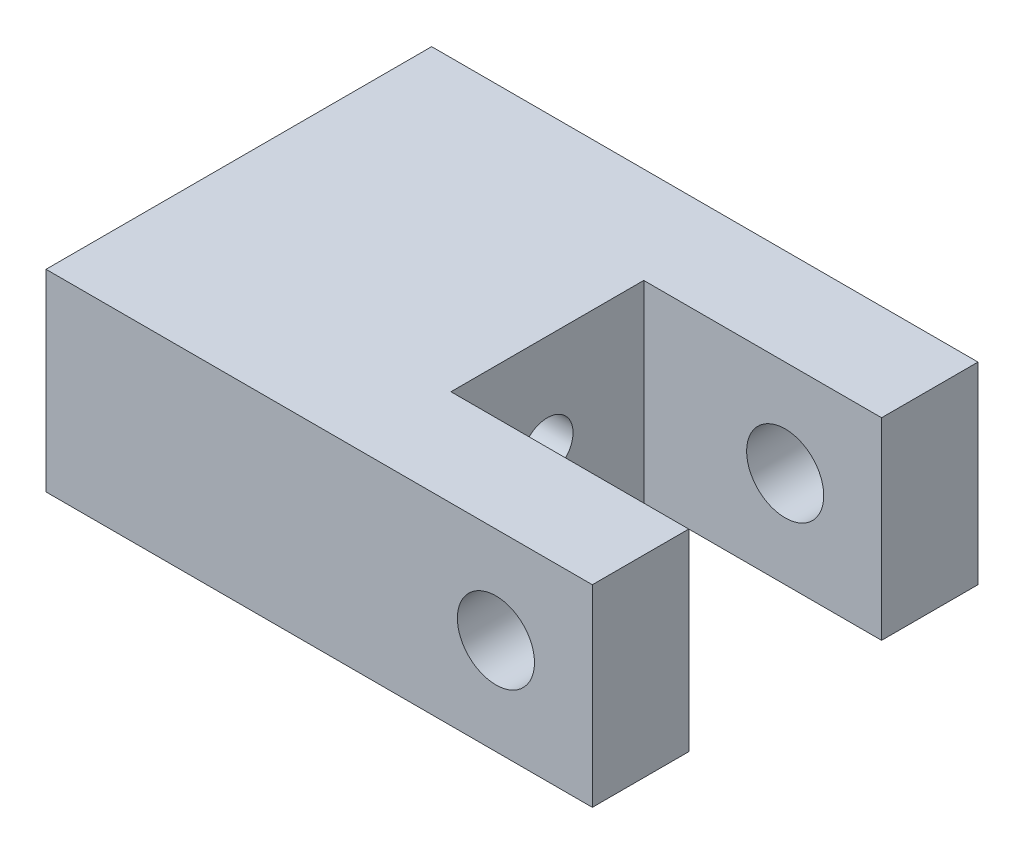
ISO-10303-21;
HEADER;
FILE_DESCRIPTION(('STEP AP214'),'2;1');
FILE_NAME('part.step','',(''),(''),'','','');
FILE_SCHEMA(('AUTOMOTIVE_DESIGN { 1 0 10303 214 1 1 1 1 }'));
ENDSEC;
DATA;
#1=APPLICATION_CONTEXT('core data for automotive mechanical design processes');
#2=APPLICATION_PROTOCOL_DEFINITION('international standard','automotive_design',2000,#1);
#3=PRODUCT_CONTEXT('',#1,'mechanical');
#4=PRODUCT('Part','Part','',(#3));
#5=PRODUCT_RELATED_PRODUCT_CATEGORY('part','',(#4));
#6=PRODUCT_DEFINITION_FORMATION('','',#4);
#7=PRODUCT_DEFINITION_CONTEXT('part definition',#1,'design');
#8=PRODUCT_DEFINITION('design','',#6,#7);
#9=PRODUCT_DEFINITION_SHAPE('','',#8);
#10=(LENGTH_UNIT() NAMED_UNIT(*) SI_UNIT(.MILLI.,.METRE.));
#11=(NAMED_UNIT(*) PLANE_ANGLE_UNIT() SI_UNIT($,.RADIAN.));
#12=(NAMED_UNIT(*) SI_UNIT($,.STERADIAN.) SOLID_ANGLE_UNIT());
#13=UNCERTAINTY_MEASURE_WITH_UNIT(LENGTH_MEASURE(1.E-05),#10,'distance_accuracy_value','');
#14=(GEOMETRIC_REPRESENTATION_CONTEXT(3) GLOBAL_UNCERTAINTY_ASSIGNED_CONTEXT((#13)) GLOBAL_UNIT_ASSIGNED_CONTEXT((#10,
#11,#12)) REPRESENTATION_CONTEXT('',''));
#15=CARTESIAN_POINT('',(0.,0.,0.));
#16=DIRECTION('',(0.,0.,1.));
#17=DIRECTION('',(1.,0.,0.));
#18=AXIS2_PLACEMENT_3D('',#15,#16,#17);
#19=CARTESIAN_POINT('',(15.,15.,30.));
#20=DIRECTION('',(-1.,0.,0.));
#21=DIRECTION('',(0.,0.,1.));
#22=AXIS2_PLACEMENT_3D('',#19,#20,#21);
#23=PLANE('',#22);
#24=DIRECTION('',(0.,0.,-1.));
#25=VECTOR('',#24,1.);
#26=CARTESIAN_POINT('',(15.,15.,30.));
#27=LINE('',#26,#25);
#28=CARTESIAN_POINT('',(15.,15.,-15.));
#29=VERTEX_POINT('',#28);
#30=CARTESIAN_POINT('',(15.,15.,-30.));
#31=VERTEX_POINT('',#30);
#32=EDGE_CURVE('E216',#29,#31,#27,.T.);
#33=ORIENTED_EDGE('',*,*,#32,.F.);
#34=DIRECTION('',(0.,1.,0.));
#35=VECTOR('',#34,1.);
#36=CARTESIAN_POINT('',(15.,-15.,-15.));
#37=LINE('',#36,#35);
#38=CARTESIAN_POINT('',(15.,-15.,-15.));
#39=VERTEX_POINT('',#38);
#40=EDGE_CURVE('E195',#39,#29,#37,.T.);
#41=ORIENTED_EDGE('',*,*,#40,.F.);
#42=DIRECTION('',(0.,0.,-1.));
#43=VECTOR('',#42,1.);
#44=CARTESIAN_POINT('',(15.,-15.,30.));
#45=LINE('',#44,#43);
#46=CARTESIAN_POINT('',(15.,-15.,-30.));
#47=VERTEX_POINT('',#46);
#48=EDGE_CURVE('E230',#39,#47,#45,.T.);
#49=ORIENTED_EDGE('',*,*,#48,.T.);
#50=DIRECTION('',(0.,-1.,0.));
#51=VECTOR('',#50,1.);
#52=CARTESIAN_POINT('',(15.,15.,-30.));
#53=LINE('',#52,#51);
#54=EDGE_CURVE('E239',#31,#47,#53,.T.);
#55=ORIENTED_EDGE('',*,*,#54,.F.);
#56=EDGE_LOOP('',(#33,#41,#49,#55));
#57=FACE_BOUND('',#56,.T.);
#58=ADVANCED_FACE('F52',(#57),#23,.F.);
#59=CARTESIAN_POINT('',(0.,0.,30.));
#60=DIRECTION('',(0.,0.,1.));
#61=DIRECTION('',(1.,0.,0.));
#62=AXIS2_PLACEMENT_3D('',#59,#60,#61);
#63=CYLINDRICAL_SURFACE('',#62,5.99999999999999);
#64=CARTESIAN_POINT('',(0.,0.,-15.));
#65=DIRECTION('',(0.,0.,-1.));
#66=DIRECTION('',(-1.,0.,0.));
#67=AXIS2_PLACEMENT_3D('',#64,#65,#66);
#68=CIRCLE('',#67,5.99999999999999);
#69=CARTESIAN_POINT('',(-5.99999999999999,0.,-15.));
#70=VERTEX_POINT('',#69);
#71=EDGE_CURVE('E56',#70,#70,#68,.F.);
#72=ORIENTED_EDGE('',*,*,#71,.T.);
#73=EDGE_LOOP('',(#72));
#74=FACE_BOUND('',#73,.T.);
#75=CARTESIAN_POINT('',(0.,0.,-30.));
#76=DIRECTION('',(0.,0.,1.));
#77=DIRECTION('',(1.,0.,0.));
#78=AXIS2_PLACEMENT_3D('',#75,#76,#77);
#79=CIRCLE('',#78,5.99999999999999);
#80=CARTESIAN_POINT('',(5.99999999999999,0.,-30.));
#81=VERTEX_POINT('',#80);
#82=EDGE_CURVE('E202',#81,#81,#79,.T.);
#83=ORIENTED_EDGE('',*,*,#82,.F.);
#84=EDGE_LOOP('',(#83));
#85=FACE_BOUND('',#84,.T.);
#86=ADVANCED_FACE('F254',(#74,#85),#63,.F.);
#87=CARTESIAN_POINT('',(-70.,15.,30.));
#88=DIRECTION('',(1.,0.,0.));
#89=DIRECTION('',(0.,0.,-1.));
#90=AXIS2_PLACEMENT_3D('',#87,#88,#89);
#91=PLANE('',#90);
#92=CARTESIAN_POINT('',(-70.,0.,20.));
#93=DIRECTION('',(-1.,0.,0.));
#94=DIRECTION('',(0.,0.,1.));
#95=AXIS2_PLACEMENT_3D('',#92,#93,#94);
#96=CIRCLE('',#95,5.1);
#97=CARTESIAN_POINT('',(-70.,0.,25.1));
#98=VERTEX_POINT('',#97);
#99=EDGE_CURVE('E146',#98,#98,#96,.T.);
#100=ORIENTED_EDGE('',*,*,#99,.F.);
#101=EDGE_LOOP('',(#100));
#102=FACE_BOUND('',#101,.T.);
#103=CARTESIAN_POINT('',(-70.,0.,-20.));
#104=DIRECTION('',(-1.,0.,0.));
#105=DIRECTION('',(0.,0.,1.));
#106=AXIS2_PLACEMENT_3D('',#103,#104,#105);
#107=CIRCLE('',#106,5.1);
#108=CARTESIAN_POINT('',(-70.,0.,-14.9));
#109=VERTEX_POINT('',#108);
#110=EDGE_CURVE('E145',#109,#109,#107,.T.);
#111=ORIENTED_EDGE('',*,*,#110,.F.);
#112=EDGE_LOOP('',(#111));
#113=FACE_BOUND('',#112,.T.);
#114=CARTESIAN_POINT('',(-70.,0.,0.));
#115=DIRECTION('',(-1.,0.,0.));
#116=DIRECTION('',(0.,0.,1.));
#117=AXIS2_PLACEMENT_3D('',#114,#115,#116);
#118=CIRCLE('',#117,3.99999999999999);
#119=CARTESIAN_POINT('',(-70.,0.,4.));
#120=VERTEX_POINT('',#119);
#121=EDGE_CURVE('E160',#120,#120,#118,.T.);
#122=ORIENTED_EDGE('',*,*,#121,.F.);
#123=EDGE_LOOP('',(#122));
#124=FACE_BOUND('',#123,.T.);
#125=DIRECTION('',(0.,0.,1.));
#126=VECTOR('',#125,1.);
#127=CARTESIAN_POINT('',(-70.,-15.,30.));
#128=LINE('',#127,#126);
#129=CARTESIAN_POINT('',(-70.,-15.,-30.));
#130=VERTEX_POINT('',#129);
#131=CARTESIAN_POINT('',(-70.,-15.,30.));
#132=VERTEX_POINT('',#131);
#133=EDGE_CURVE('E210',#130,#132,#128,.T.);
#134=ORIENTED_EDGE('',*,*,#133,.T.);
#135=DIRECTION('',(0.,-1.,0.));
#136=VECTOR('',#135,1.);
#137=CARTESIAN_POINT('',(-70.,15.,30.));
#138=LINE('',#137,#136);
#139=CARTESIAN_POINT('',(-70.,15.,30.));
#140=VERTEX_POINT('',#139);
#141=EDGE_CURVE('E13',#140,#132,#138,.T.);
#142=ORIENTED_EDGE('',*,*,#141,.F.);
#143=DIRECTION('',(0.,0.,1.));
#144=VECTOR('',#143,1.);
#145=CARTESIAN_POINT('',(-70.,15.,30.));
#146=LINE('',#145,#144);
#147=CARTESIAN_POINT('',(-70.,15.,-30.));
#148=VERTEX_POINT('',#147);
#149=EDGE_CURVE('E211',#148,#140,#146,.T.);
#150=ORIENTED_EDGE('',*,*,#149,.F.);
#151=DIRECTION('',(0.,-1.,0.));
#152=VECTOR('',#151,1.);
#153=CARTESIAN_POINT('',(-70.,15.,-30.));
#154=LINE('',#153,#152);
#155=EDGE_CURVE('E223',#148,#130,#154,.T.);
#156=ORIENTED_EDGE('',*,*,#155,.T.);
#157=EDGE_LOOP('',(#134,#142,#150,#156));
#158=FACE_BOUND('',#157,.T.);
#159=ADVANCED_FACE('F54',(#102,#113,#124,#158),#91,.F.);
#160=CARTESIAN_POINT('',(15.,15.,30.));
#161=DIRECTION('',(0.,0.,-1.));
#162=DIRECTION('',(-1.,0.,0.));
#163=AXIS2_PLACEMENT_3D('',#160,#161,#162);
#164=PLANE('',#163);
#165=CARTESIAN_POINT('',(0.,0.,30.));
#166=DIRECTION('',(0.,0.,1.));
#167=DIRECTION('',(1.,0.,0.));
#168=AXIS2_PLACEMENT_3D('',#165,#166,#167);
#169=CIRCLE('',#168,5.99999999999999);
#170=CARTESIAN_POINT('',(5.99999999999999,0.,30.));
#171=VERTEX_POINT('',#170);
#172=EDGE_CURVE('E206',#171,#171,#169,.T.);
#173=ORIENTED_EDGE('',*,*,#172,.F.);
#174=EDGE_LOOP('',(#173));
#175=FACE_BOUND('',#174,.T.);
#176=DIRECTION('',(1.,0.,0.));
#177=VECTOR('',#176,1.);
#178=CARTESIAN_POINT('',(15.,-15.,30.));
#179=LINE('',#178,#177);
#180=CARTESIAN_POINT('',(15.,-15.,30.));
#181=VERTEX_POINT('',#180);
#182=EDGE_CURVE('E227',#132,#181,#179,.T.);
#183=ORIENTED_EDGE('',*,*,#182,.T.);
#184=DIRECTION('',(0.,-1.,0.));
#185=VECTOR('',#184,1.);
#186=CARTESIAN_POINT('',(15.,15.,30.));
#187=LINE('',#186,#185);
#188=CARTESIAN_POINT('',(15.,15.,30.));
#189=VERTEX_POINT('',#188);
#190=EDGE_CURVE('E62',#189,#181,#187,.T.);
#191=ORIENTED_EDGE('',*,*,#190,.F.);
#192=DIRECTION('',(1.,0.,0.));
#193=VECTOR('',#192,1.);
#194=CARTESIAN_POINT('',(15.,15.,30.));
#195=LINE('',#194,#193);
#196=EDGE_CURVE('E107',#140,#189,#195,.T.);
#197=ORIENTED_EDGE('',*,*,#196,.F.);
#198=ORIENTED_EDGE('',*,*,#141,.T.);
#199=EDGE_LOOP('',(#183,#191,#197,#198));
#200=FACE_BOUND('',#199,.T.);
#201=ADVANCED_FACE('F283',(#175,#200),#164,.F.);
#202=CARTESIAN_POINT('',(15.,-15.,15.));
#203=VERTEX_POINT('',#202);
#204=EDGE_CURVE('E231',#181,#203,#45,.T.);
#205=ORIENTED_EDGE('',*,*,#204,.T.);
#206=DIRECTION('',(0.,1.,0.));
#207=VECTOR('',#206,1.);
#208=CARTESIAN_POINT('',(15.,-15.,15.));
#209=LINE('',#208,#207);
#210=CARTESIAN_POINT('',(15.,15.,15.));
#211=VERTEX_POINT('',#210);
#212=EDGE_CURVE('E70',#203,#211,#209,.T.);
#213=ORIENTED_EDGE('',*,*,#212,.T.);
#214=EDGE_CURVE('E217',#189,#211,#27,.T.);
#215=ORIENTED_EDGE('',*,*,#214,.F.);
#216=ORIENTED_EDGE('',*,*,#190,.T.);
#217=EDGE_LOOP('',(#205,#213,#215,#216));
#218=FACE_BOUND('',#217,.T.);
#219=ADVANCED_FACE('F275',(#218),#23,.F.);
#220=CARTESIAN_POINT('',(15.,15.,-30.));
#221=DIRECTION('',(0.,0.,1.));
#222=DIRECTION('',(1.,0.,0.));
#223=AXIS2_PLACEMENT_3D('',#220,#221,#222);
#224=PLANE('',#223);
#225=ORIENTED_EDGE('',*,*,#82,.T.);
#226=EDGE_LOOP('',(#225));
#227=FACE_BOUND('',#226,.T.);
#228=DIRECTION('',(-1.,0.,0.));
#229=VECTOR('',#228,1.);
#230=CARTESIAN_POINT('',(15.,-15.,-30.));
#231=LINE('',#230,#229);
#232=EDGE_CURVE('E100',#47,#130,#231,.T.);
#233=ORIENTED_EDGE('',*,*,#232,.T.);
#234=ORIENTED_EDGE('',*,*,#155,.F.);
#235=DIRECTION('',(-1.,0.,0.));
#236=VECTOR('',#235,1.);
#237=CARTESIAN_POINT('',(15.,15.,-30.));
#238=LINE('',#237,#236);
#239=EDGE_CURVE('E79',#31,#148,#238,.T.);
#240=ORIENTED_EDGE('',*,*,#239,.F.);
#241=ORIENTED_EDGE('',*,*,#54,.T.);
#242=EDGE_LOOP('',(#233,#234,#240,#241));
#243=FACE_BOUND('',#242,.T.);
#244=ADVANCED_FACE('F282',(#227,#243),#224,.F.);
#245=CARTESIAN_POINT('',(-70.,15.,30.));
#246=DIRECTION('',(0.,1.,0.));
#247=DIRECTION('',(0.,0.,1.));
#248=AXIS2_PLACEMENT_3D('',#245,#246,#247);
#249=PLANE('',#248);
#250=DIRECTION('',(-1.,0.,0.));
#251=VECTOR('',#250,1.);
#252=CARTESIAN_POINT('',(15.,15.,-15.));
#253=LINE('',#252,#251);
#254=CARTESIAN_POINT('',(-22.,15.,-15.));
#255=VERTEX_POINT('',#254);
#256=EDGE_CURVE('E174',#29,#255,#253,.T.);
#257=ORIENTED_EDGE('',*,*,#256,.F.);
#258=ORIENTED_EDGE('',*,*,#32,.T.);
#259=ORIENTED_EDGE('',*,*,#239,.T.);
#260=ORIENTED_EDGE('',*,*,#149,.T.);
#261=ORIENTED_EDGE('',*,*,#196,.T.);
#262=ORIENTED_EDGE('',*,*,#214,.T.);
#263=DIRECTION('',(1.,0.,0.));
#264=VECTOR('',#263,1.);
#265=CARTESIAN_POINT('',(15.,15.,15.));
#266=LINE('',#265,#264);
#267=CARTESIAN_POINT('',(-22.,15.,15.));
#268=VERTEX_POINT('',#267);
#269=EDGE_CURVE('E185',#268,#211,#266,.T.);
#270=ORIENTED_EDGE('',*,*,#269,.F.);
#271=DIRECTION('',(0.,0.,1.));
#272=VECTOR('',#271,1.);
#273=CARTESIAN_POINT('',(-22.,15.,15.));
#274=LINE('',#273,#272);
#275=EDGE_CURVE('E168',#255,#268,#274,.T.);
#276=ORIENTED_EDGE('',*,*,#275,.F.);
#277=EDGE_LOOP('',(#257,#258,#259,#260,#261,#262,#270,#276));
#278=FACE_BOUND('',#277,.T.);
#279=ADVANCED_FACE('F289',(#278),#249,.T.);
#280=CARTESIAN_POINT('',(-70.,-15.,30.));
#281=DIRECTION('',(0.,1.,0.));
#282=DIRECTION('',(0.,0.,1.));
#283=AXIS2_PLACEMENT_3D('',#280,#281,#282);
#284=PLANE('',#283);
#285=ORIENTED_EDGE('',*,*,#48,.F.);
#286=DIRECTION('',(-1.,0.,0.));
#287=VECTOR('',#286,1.);
#288=CARTESIAN_POINT('',(15.,-15.,-15.));
#289=LINE('',#288,#287);
#290=CARTESIAN_POINT('',(-22.,-15.,-15.));
#291=VERTEX_POINT('',#290);
#292=EDGE_CURVE('E177',#39,#291,#289,.T.);
#293=ORIENTED_EDGE('',*,*,#292,.T.);
#294=DIRECTION('',(0.,0.,1.));
#295=VECTOR('',#294,1.);
#296=CARTESIAN_POINT('',(-22.,-15.,15.));
#297=LINE('',#296,#295);
#298=CARTESIAN_POINT('',(-22.,-15.,15.));
#299=VERTEX_POINT('',#298);
#300=EDGE_CURVE('E169',#291,#299,#297,.T.);
#301=ORIENTED_EDGE('',*,*,#300,.T.);
#302=DIRECTION('',(1.,0.,0.));
#303=VECTOR('',#302,1.);
#304=CARTESIAN_POINT('',(15.,-15.,15.));
#305=LINE('',#304,#303);
#306=EDGE_CURVE('E173',#299,#203,#305,.T.);
#307=ORIENTED_EDGE('',*,*,#306,.T.);
#308=ORIENTED_EDGE('',*,*,#204,.F.);
#309=ORIENTED_EDGE('',*,*,#182,.F.);
#310=ORIENTED_EDGE('',*,*,#133,.F.);
#311=ORIENTED_EDGE('',*,*,#232,.F.);
#312=EDGE_LOOP('',(#285,#293,#301,#307,#308,#309,#310,#311));
#313=FACE_BOUND('',#312,.T.);
#314=ADVANCED_FACE('F269',(#313),#284,.F.);
#315=CARTESIAN_POINT('',(0.,0.,15.));
#316=DIRECTION('',(0.,0.,1.));
#317=DIRECTION('',(1.,0.,0.));
#318=AXIS2_PLACEMENT_3D('',#315,#316,#317);
#319=CIRCLE('',#318,5.99999999999999);
#320=CARTESIAN_POINT('',(5.99999999999999,0.,15.));
#321=VERTEX_POINT('',#320);
#322=EDGE_CURVE('E194',#321,#321,#319,.F.);
#323=ORIENTED_EDGE('',*,*,#322,.T.);
#324=EDGE_LOOP('',(#323));
#325=FACE_BOUND('',#324,.T.);
#326=ORIENTED_EDGE('',*,*,#172,.T.);
#327=EDGE_LOOP('',(#326));
#328=FACE_BOUND('',#327,.T.);
#329=ADVANCED_FACE('F260',(#325,#328),#63,.F.);
#330=CARTESIAN_POINT('',(15.,-15.,-15.));
#331=DIRECTION('',(0.,0.,-1.));
#332=DIRECTION('',(-1.,0.,0.));
#333=AXIS2_PLACEMENT_3D('',#330,#331,#332);
#334=PLANE('',#333);
#335=ORIENTED_EDGE('',*,*,#256,.T.);
#336=DIRECTION('',(0.,1.,0.));
#337=VECTOR('',#336,1.);
#338=CARTESIAN_POINT('',(-22.,-15.,-15.));
#339=LINE('',#338,#337);
#340=EDGE_CURVE('E191',#291,#255,#339,.T.);
#341=ORIENTED_EDGE('',*,*,#340,.F.);
#342=ORIENTED_EDGE('',*,*,#292,.F.);
#343=ORIENTED_EDGE('',*,*,#40,.T.);
#344=EDGE_LOOP('',(#335,#341,#342,#343));
#345=FACE_BOUND('',#344,.T.);
#346=ORIENTED_EDGE('',*,*,#71,.F.);
#347=EDGE_LOOP('',(#346));
#348=FACE_BOUND('',#347,.T.);
#349=ADVANCED_FACE('F257',(#345,#348),#334,.F.);
#350=CARTESIAN_POINT('',(15.,-15.,15.));
#351=DIRECTION('',(0.,0.,1.));
#352=DIRECTION('',(1.,0.,0.));
#353=AXIS2_PLACEMENT_3D('',#350,#351,#352);
#354=PLANE('',#353);
#355=ORIENTED_EDGE('',*,*,#269,.T.);
#356=ORIENTED_EDGE('',*,*,#212,.F.);
#357=ORIENTED_EDGE('',*,*,#306,.F.);
#358=DIRECTION('',(0.,1.,0.));
#359=VECTOR('',#358,1.);
#360=CARTESIAN_POINT('',(-22.,-15.,15.));
#361=LINE('',#360,#359);
#362=EDGE_CURVE('E181',#299,#268,#361,.T.);
#363=ORIENTED_EDGE('',*,*,#362,.T.);
#364=EDGE_LOOP('',(#355,#356,#357,#363));
#365=FACE_BOUND('',#364,.T.);
#366=ORIENTED_EDGE('',*,*,#322,.F.);
#367=EDGE_LOOP('',(#366));
#368=FACE_BOUND('',#367,.T.);
#369=ADVANCED_FACE('F259',(#365,#368),#354,.F.);
#370=CARTESIAN_POINT('',(-22.,-15.,15.));
#371=DIRECTION('',(-1.,0.,0.));
#372=DIRECTION('',(0.,0.,1.));
#373=AXIS2_PLACEMENT_3D('',#370,#371,#372);
#374=PLANE('',#373);
#375=CARTESIAN_POINT('',(-22.,0.,0.));
#376=DIRECTION('',(-1.,0.,0.));
#377=DIRECTION('',(0.,0.,1.));
#378=AXIS2_PLACEMENT_3D('',#375,#376,#377);
#379=CIRCLE('',#378,3.99999999999999);
#380=CARTESIAN_POINT('',(-22.,0.,3.99999999999999));
#381=VERTEX_POINT('',#380);
#382=EDGE_CURVE('E164',#381,#381,#379,.T.);
#383=ORIENTED_EDGE('',*,*,#382,.T.);
#384=EDGE_LOOP('',(#383));
#385=FACE_BOUND('',#384,.T.);
#386=ORIENTED_EDGE('',*,*,#275,.T.);
#387=ORIENTED_EDGE('',*,*,#362,.F.);
#388=ORIENTED_EDGE('',*,*,#300,.F.);
#389=ORIENTED_EDGE('',*,*,#340,.T.);
#390=EDGE_LOOP('',(#386,#387,#388,#389));
#391=FACE_BOUND('',#390,.T.);
#392=ADVANCED_FACE('F267',(#385,#391),#374,.F.);
#393=CARTESIAN_POINT('',(-70.,0.,0.));
#394=DIRECTION('',(-1.,0.,0.));
#395=DIRECTION('',(0.,0.,1.));
#396=AXIS2_PLACEMENT_3D('',#393,#394,#395);
#397=CYLINDRICAL_SURFACE('',#396,3.99999999999999);
#398=ORIENTED_EDGE('',*,*,#121,.T.);
#399=EDGE_LOOP('',(#398));
#400=FACE_BOUND('',#399,.T.);
#401=ORIENTED_EDGE('',*,*,#382,.F.);
#402=EDGE_LOOP('',(#401));
#403=FACE_BOUND('',#402,.T.);
#404=ADVANCED_FACE('F336',(#400,#403),#397,.F.);
#405=CARTESIAN_POINT('',(-42.75,0.,-20.));
#406=DIRECTION('',(-1.,0.,0.));
#407=DIRECTION('',(0.,0.,1.));
#408=AXIS2_PLACEMENT_3D('',#405,#406,#407);
#409=CONICAL_SURFACE('',#408,5.09999999999999,1.02974425867665);
#410=CARTESIAN_POINT('',(-39.6856108429595,0.,-20.));
#411=VERTEX_POINT('',#410);
#412=VERTEX_LOOP('',#411);
#413=FACE_BOUND('',#412,.T.);
#414=CARTESIAN_POINT('',(-42.75,0.,-20.));
#415=DIRECTION('',(-1.,0.,0.));
#416=DIRECTION('',(0.,0.,1.));
#417=AXIS2_PLACEMENT_3D('',#414,#415,#416);
#418=CIRCLE('',#417,5.09999999999999);
#419=CARTESIAN_POINT('',(-42.75,0.,-14.9));
#420=VERTEX_POINT('',#419);
#421=EDGE_CURVE('E152',#420,#420,#418,.T.);
#422=ORIENTED_EDGE('',*,*,#421,.T.);
#423=EDGE_LOOP('',(#422));
#424=FACE_BOUND('',#423,.T.);
#425=ADVANCED_FACE('F339',(#413,#424),#409,.F.);
#426=CARTESIAN_POINT('',(-70.,0.,-20.));
#427=DIRECTION('',(-1.,0.,0.));
#428=DIRECTION('',(0.,0.,1.));
#429=AXIS2_PLACEMENT_3D('',#426,#427,#428);
#430=CYLINDRICAL_SURFACE('',#429,5.1);
#431=ORIENTED_EDGE('',*,*,#421,.F.);
#432=EDGE_LOOP('',(#431));
#433=FACE_BOUND('',#432,.T.);
#434=ORIENTED_EDGE('',*,*,#110,.T.);
#435=EDGE_LOOP('',(#434));
#436=FACE_BOUND('',#435,.T.);
#437=ADVANCED_FACE('F138',(#433,#436),#430,.F.);
#438=CARTESIAN_POINT('',(-42.75,0.,20.));
#439=DIRECTION('',(-1.,0.,0.));
#440=DIRECTION('',(0.,0.,1.));
#441=AXIS2_PLACEMENT_3D('',#438,#439,#440);
#442=CONICAL_SURFACE('',#441,5.09999999999999,1.02974425867665);
#443=CARTESIAN_POINT('',(-39.6856108429595,0.,20.));
#444=VERTEX_POINT('',#443);
#445=VERTEX_LOOP('',#444);
#446=FACE_BOUND('',#445,.T.);
#447=CARTESIAN_POINT('',(-42.75,0.,20.));
#448=DIRECTION('',(-1.,0.,0.));
#449=DIRECTION('',(0.,0.,1.));
#450=AXIS2_PLACEMENT_3D('',#447,#448,#449);
#451=CIRCLE('',#450,5.09999999999999);
#452=CARTESIAN_POINT('',(-42.75,0.,25.1));
#453=VERTEX_POINT('',#452);
#454=EDGE_CURVE('E142',#453,#453,#451,.T.);
#455=ORIENTED_EDGE('',*,*,#454,.T.);
#456=EDGE_LOOP('',(#455));
#457=FACE_BOUND('',#456,.T.);
#458=ADVANCED_FACE('F134',(#446,#457),#442,.F.);
#459=CARTESIAN_POINT('',(-70.,0.,20.));
#460=DIRECTION('',(-1.,0.,0.));
#461=DIRECTION('',(0.,0.,1.));
#462=AXIS2_PLACEMENT_3D('',#459,#460,#461);
#463=CYLINDRICAL_SURFACE('',#462,5.1);
#464=ORIENTED_EDGE('',*,*,#454,.F.);
#465=EDGE_LOOP('',(#464));
#466=FACE_BOUND('',#465,.T.);
#467=ORIENTED_EDGE('',*,*,#99,.T.);
#468=EDGE_LOOP('',(#467));
#469=FACE_BOUND('',#468,.T.);
#470=ADVANCED_FACE('F137',(#466,#469),#463,.F.);
#471=CLOSED_SHELL('',(#58,#86,#159,#201,#219,#244,#279,#314,#329,#349,#369,#392,#404,#425,#437,
#458,#470));
#472=MANIFOLD_SOLID_BREP('B2',#471);
#473=ADVANCED_BREP_SHAPE_REPRESENTATION('',(#18,#472),#14);
#474=SHAPE_DEFINITION_REPRESENTATION(#9,#473);
ENDSEC;
END-ISO-10303-21;
